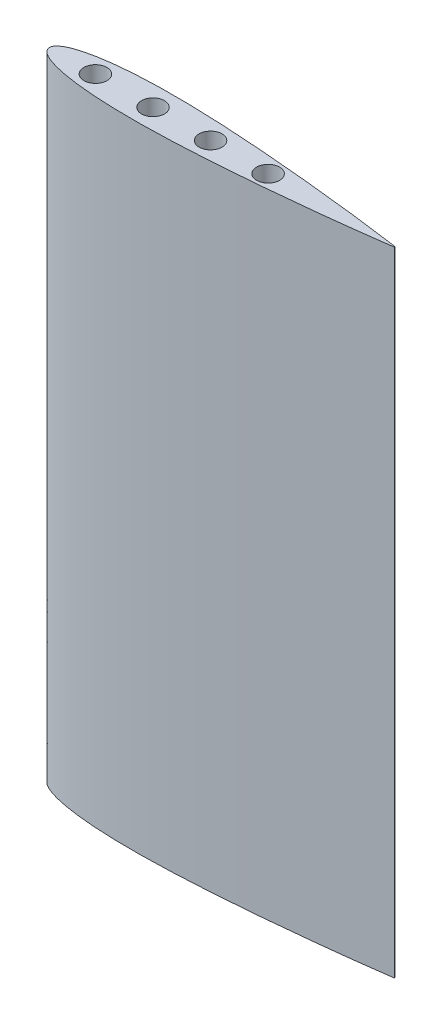
ISO-10303-21;
HEADER;
FILE_DESCRIPTION(('STEP AP214'),'2;1');
FILE_NAME('part.step','',(''),(''),'','','');
FILE_SCHEMA(('AUTOMOTIVE_DESIGN { 1 0 10303 214 1 1 1 1 }'));
ENDSEC;
DATA;
#1=APPLICATION_CONTEXT('core data for automotive mechanical design processes');
#2=APPLICATION_PROTOCOL_DEFINITION('international standard','automotive_design',2000,#1);
#3=PRODUCT_CONTEXT('',#1,'mechanical');
#4=PRODUCT('Part','Part','',(#3));
#5=PRODUCT_RELATED_PRODUCT_CATEGORY('part','',(#4));
#6=PRODUCT_DEFINITION_FORMATION('','',#4);
#7=PRODUCT_DEFINITION_CONTEXT('part definition',#1,'design');
#8=PRODUCT_DEFINITION('design','',#6,#7);
#9=PRODUCT_DEFINITION_SHAPE('','',#8);
#10=(LENGTH_UNIT() NAMED_UNIT(*) SI_UNIT(.MILLI.,.METRE.));
#11=(NAMED_UNIT(*) PLANE_ANGLE_UNIT() SI_UNIT($,.RADIAN.));
#12=(NAMED_UNIT(*) SI_UNIT($,.STERADIAN.) SOLID_ANGLE_UNIT());
#13=UNCERTAINTY_MEASURE_WITH_UNIT(LENGTH_MEASURE(1.E-05),#10,'distance_accuracy_value','');
#14=(GEOMETRIC_REPRESENTATION_CONTEXT(3) GLOBAL_UNCERTAINTY_ASSIGNED_CONTEXT((#13)) GLOBAL_UNIT_ASSIGNED_CONTEXT((#10,
#11,#12)) REPRESENTATION_CONTEXT('',''));
#15=CARTESIAN_POINT('',(0.,0.,0.));
#16=DIRECTION('',(0.,0.,1.));
#17=DIRECTION('',(1.,0.,0.));
#18=AXIS2_PLACEMENT_3D('',#15,#16,#17);
#19=CARTESIAN_POINT('',(38.1,69.85,-0.048006));
#20=CARTESIAN_POINT('',(38.0925832511895,69.85,-0.0490477650055649));
#21=CARTESIAN_POINT('',(38.0629429116157,69.85,-0.0532110809422408));
#22=CARTESIAN_POINT('',(37.9446472534428,69.85,-0.0697558566793161));
#23=CARTESIAN_POINT('',(37.7675621250952,69.85,-0.0944867430914153));
#24=CARTESIAN_POINT('',(37.5320525207163,69.85,-0.126965391859385));
#25=CARTESIAN_POINT('',(37.2903965573064,69.85,-0.160190200639637));
#26=CARTESIAN_POINT('',(37.0061271158188,69.85,-0.198904989146751));
#27=CARTESIAN_POINT('',(36.6799179371375,69.85,-0.242859005883359));
#28=CARTESIAN_POINT('',(36.3125415452336,69.85,-0.29186429375722));
#29=CARTESIAN_POINT('',(35.9048518161631,69.85,-0.345569022588783));
#30=CARTESIAN_POINT('',(35.4577986795233,69.85,-0.403720925509778));
#31=CARTESIAN_POINT('',(34.9724169838542,69.85,-0.465853222349389));
#32=CARTESIAN_POINT('',(34.2520601017265,69.85,-0.556772440334429));
#33=CARTESIAN_POINT('',(33.4845415955904,69.85,-0.651127112361376));
#34=CARTESIAN_POINT('',(32.6716373179434,69.85,-0.748448048268651));
#35=CARTESIAN_POINT('',(32.013353772097,69.85,-0.82573780924587));
#36=CARTESIAN_POINT('',(31.3247712932815,69.85,-0.904853152716957));
#37=CARTESIAN_POINT('',(30.607537281923,69.85,-0.985592030763642));
#38=CARTESIAN_POINT('',(29.8633043523687,69.85,-1.06737526082942));
#39=CARTESIAN_POINT('',(29.0938342883855,69.85,-1.14998319028334));
#40=CARTESIAN_POINT('',(28.3008940794852,69.85,-1.23282548784159));
#41=CARTESIAN_POINT('',(27.4863528469373,69.85,-1.31574863637591));
#42=CARTESIAN_POINT('',(26.6521029750128,69.85,-1.39811320683171));
#43=CARTESIAN_POINT('',(25.8001060198461,69.85,-1.47966051292485));
#44=CARTESIAN_POINT('',(24.9323404732456,69.85,-1.55982417312083));
#45=CARTESIAN_POINT('',(24.0508306191749,69.85,-1.63834210110569));
#46=CARTESIAN_POINT('',(23.1576406562735,69.85,-1.71456520147202));
#47=CARTESIAN_POINT('',(22.2548520722237,69.85,-1.78815253623454));
#48=CARTESIAN_POINT('',(21.344584785588,69.85,-1.85863416491333));
#49=CARTESIAN_POINT('',(20.428953151127,69.85,-1.92544429568828));
#50=CARTESIAN_POINT('',(19.5101089419927,69.85,-1.98816390230937));
#51=CARTESIAN_POINT('',(18.5901970685773,69.85,-2.04629199099451));
#52=CARTESIAN_POINT('',(17.6713468380571,69.85,-2.09926717966133));
#53=CARTESIAN_POINT('',(16.4547325832718,69.85,-2.16225319255771));
#54=CARTESIAN_POINT('',(14.9525757685026,69.85,-2.22569702265708));
#55=CARTESIAN_POINT('',(13.4659715477156,69.85,-2.26664545387174));
#56=CARTESIAN_POINT('',(12.3000911317475,69.85,-2.28358455102066));
#57=CARTESIAN_POINT('',(11.4480350286495,69.85,-2.28804827308279));
#58=CARTESIAN_POINT('',(10.6137266551807,69.85,-2.28410223520021));
#59=CARTESIAN_POINT('',(9.79911860646168,69.85,-2.27156902201927));
#60=CARTESIAN_POINT('',(9.00611977020172,69.85,-2.25006986753476));
#61=CARTESIAN_POINT('',(8.2365645526512,69.85,-2.21969990978284));
#62=CARTESIAN_POINT('',(7.49224861011493,69.85,-2.18024093358907));
#63=CARTESIAN_POINT('',(6.77490480464143,69.85,-2.13180353660556));
#64=CARTESIAN_POINT('',(6.08622231888325,69.85,-2.07439781875663));
#65=CARTESIAN_POINT('',(5.42780229802141,69.85,-2.00812811550919));
#66=CARTESIAN_POINT('',(4.80117460273118,69.85,-1.93324581886227));
#67=CARTESIAN_POINT('',(4.20778385491808,69.85,-1.85005530448883));
#68=CARTESIAN_POINT('',(3.64902794191651,69.85,-1.75871164667066));
#69=CARTESIAN_POINT('',(3.1261874267588,69.85,-1.65967136646688));
#70=CARTESIAN_POINT('',(2.64046561827519,69.85,-1.55330686977665));
#71=CARTESIAN_POINT('',(2.19299768796404,69.85,-1.43997872175089));
#72=CARTESIAN_POINT('',(1.78477240041268,69.85,-1.32019461373086));
#73=CARTESIAN_POINT('',(1.416689891716,69.85,-1.1943523482514));
#74=CARTESIAN_POINT('',(1.0895351178981,69.85,-1.06288655664468));
#75=CARTESIAN_POINT('',(0.803955696852375,69.85,-0.926176493001448));
#76=CARTESIAN_POINT('',(0.560495694538755,69.85,-0.784506781043438));
#77=CARTESIAN_POINT('',(0.359438610040117,69.85,-0.638117578672457));
#78=CARTESIAN_POINT('',(0.201172940149243,69.85,-0.486768083972346));
#79=CARTESIAN_POINT('',(0.0860803469315414,69.85,-0.330029548931076));
#80=CARTESIAN_POINT('',(0.0157125538685244,69.85,-0.167135854074328));
#81=CARTESIAN_POINT('',(-0.00765895667675501,69.85,0.));
#82=CARTESIAN_POINT('',(0.0157125538685251,69.85,0.167135854074332));
#83=CARTESIAN_POINT('',(0.08608034693154,69.85,0.330029548931073));
#84=CARTESIAN_POINT('',(0.201172940149245,69.85,0.486768083972348));
#85=CARTESIAN_POINT('',(0.359438610040117,69.85,0.638117578672457));
#86=CARTESIAN_POINT('',(0.560495694538755,69.85,0.784506781043438));
#87=CARTESIAN_POINT('',(0.803955696852377,69.85,0.926176493001449));
#88=CARTESIAN_POINT('',(1.0895351178981,69.85,1.06288655664468));
#89=CARTESIAN_POINT('',(1.416689891716,69.85,1.1943523482514));
#90=CARTESIAN_POINT('',(1.78477240041268,69.85,1.32019461373086));
#91=CARTESIAN_POINT('',(2.19299768796404,69.85,1.43997872175089));
#92=CARTESIAN_POINT('',(2.64046561827519,69.85,1.55330686977665));
#93=CARTESIAN_POINT('',(3.1261874267588,69.85,1.65967136646688));
#94=CARTESIAN_POINT('',(3.64902794191651,69.85,1.75871164667066));
#95=CARTESIAN_POINT('',(4.20778385491808,69.85,1.85005530448883));
#96=CARTESIAN_POINT('',(4.80117460273118,69.85,1.93324581886227));
#97=CARTESIAN_POINT('',(5.42780229802141,69.85,2.00812811550919));
#98=CARTESIAN_POINT('',(6.08622231888325,69.85,2.07439781875663));
#99=CARTESIAN_POINT('',(6.77490480464143,69.85,2.13180353660556));
#100=CARTESIAN_POINT('',(7.49224861011493,69.85,2.18024093358907));
#101=CARTESIAN_POINT('',(8.23656455265121,69.85,2.21969990978284));
#102=CARTESIAN_POINT('',(9.00611977020172,69.85,2.25006986753476));
#103=CARTESIAN_POINT('',(9.79911860646167,69.85,2.27156902201927));
#104=CARTESIAN_POINT('',(10.6137266551807,69.85,2.2841022352002));
#105=CARTESIAN_POINT('',(11.4480350286495,69.85,2.28804827308279));
#106=CARTESIAN_POINT('',(12.3000911317475,69.85,2.28358455102066));
#107=CARTESIAN_POINT('',(13.4659715477156,69.85,2.26664545387174));
#108=CARTESIAN_POINT('',(14.6487121561619,69.85,2.23406692908852));
#109=CARTESIAN_POINT('',(16.1510694338133,69.85,2.17621559673462));
#110=CARTESIAN_POINT('',(17.3678808007291,69.85,2.11676314369055));
#111=CARTESIAN_POINT('',(18.5901970685773,69.85,2.04629199099451));
#112=CARTESIAN_POINT('',(19.5101089419927,69.85,1.98816390230937));
#113=CARTESIAN_POINT('',(20.428953151127,69.85,1.92544429568828));
#114=CARTESIAN_POINT('',(21.344584785588,69.85,1.85863416491333));
#115=CARTESIAN_POINT('',(22.2548520722237,69.85,1.78815253623454));
#116=CARTESIAN_POINT('',(23.1576406562735,69.85,1.71456520147202));
#117=CARTESIAN_POINT('',(24.0508306191749,69.85,1.63834210110569));
#118=CARTESIAN_POINT('',(24.9323404732456,69.85,1.55982417312083));
#119=CARTESIAN_POINT('',(25.8001060198462,69.85,1.47966051292485));
#120=CARTESIAN_POINT('',(26.6521029750128,69.85,1.39811320683171));
#121=CARTESIAN_POINT('',(27.4863528469373,69.85,1.31574863637591));
#122=CARTESIAN_POINT('',(28.3008940794852,69.85,1.23282548784159));
#123=CARTESIAN_POINT('',(29.0938342883855,69.85,1.14998319028334));
#124=CARTESIAN_POINT('',(29.8633043523686,69.85,1.06737526082942));
#125=CARTESIAN_POINT('',(30.607537281923,69.85,0.985592030763641));
#126=CARTESIAN_POINT('',(31.3247712932815,69.85,0.904853152716957));
#127=CARTESIAN_POINT('',(32.013353772097,69.85,0.825737809245871));
#128=CARTESIAN_POINT('',(32.6716373179434,69.85,0.74844804826865));
#129=CARTESIAN_POINT('',(33.4845415955904,69.85,0.651127112361377));
#130=CARTESIAN_POINT('',(34.2520601017265,69.85,0.556772440334429));
#131=CARTESIAN_POINT('',(34.9724169838542,69.85,0.465853222349389));
#132=CARTESIAN_POINT('',(35.4577986795233,69.85,0.403720925509777));
#133=CARTESIAN_POINT('',(35.9048518161631,69.85,0.345569022588783));
#134=CARTESIAN_POINT('',(36.3125415452337,69.85,0.29186429375722));
#135=CARTESIAN_POINT('',(36.6799179371375,69.85,0.242859005883359));
#136=CARTESIAN_POINT('',(37.0061271158188,69.85,0.198904989146751));
#137=CARTESIAN_POINT('',(37.2903965573064,69.85,0.160190200639636));
#138=CARTESIAN_POINT('',(37.5320525207163,69.85,0.126965391859385));
#139=CARTESIAN_POINT('',(37.7675621250952,69.85,0.0944867430914158));
#140=CARTESIAN_POINT('',(37.9446472534428,69.85,0.0697558566793164));
#141=CARTESIAN_POINT('',(38.0629429116156,69.85,0.0532110809422402));
#142=CARTESIAN_POINT('',(38.0925832511895,69.85,0.0490477650055649));
#143=CARTESIAN_POINT('',(38.1,69.85,0.048006));
#144=B_SPLINE_CURVE_WITH_KNOTS('',3,(#19,#20,#21,#22,#23,#24,#25,#26,#27,#28,#29,#30,#31,#32,
#33,#34,#35,#36,#37,#38,#39,#40,#41,#42,#43,#44,#45,#46,#47,#48,#49,#50,#51,#52,#53,#54,#55,#56,
#57,#58,#59,#60,#61,#62,#63,#64,#65,#66,#67,#68,#69,#70,#71,#72,#73,#74,#75,#76,#77,#78,#79,#80,
#81,#82,#83,#84,#85,#86,#87,#88,#89,#90,#91,#92,#93,#94,#95,#96,#97,#98,#99,#100,#101,#102,#103,
#104,#105,#106,#107,#108,#109,#110,#111,#112,#113,#114,#115,#116,#117,#118,#119,#120,#121,#122,
#123,#124,#125,#126,#127,#128,#129,#130,#131,#132,#133,#134,#135,#136,#137,#138,#139,#140,#141,
#142,#143),.UNSPECIFIED.,.F.,.F.,(4,1,1,1,1,1,1,1,1,1,1,1,1,1,1,1,1,1,1,1,1,1,1,1,1,1,1,1,1,1,1,
1,1,1,1,1,1,1,1,1,1,1,1,1,1,1,1,1,1,1,1,1,1,1,1,1,1,1,1,1,1,1,1,1,1,1,1,1,1,1,1,1,1,1,1,1,1,1,1,
1,1,1,1,1,1,1,1,1,1,1,1,1,1,1,1,1,1,1,1,1,1,1,1,1,1,1,1,1,1,1,1,1,1,1,1,1,1,1,1,1,1,1,4),(0.,
0.000289201378228521,0.00115576612811497,0.00461232240327458,0.00719351750498132,
0.0103357928948399,0.0140313969623455,0.018271612085312,0.0230458473649678,0.028342900869087,
0.0341501195438392,0.0404537601194176,0.0472383298988337,0.0621866127014249,0.0703137241968128,
0.0788519079930909,0.0877801263970521,0.0970775209084767,0.106722048517726,0.116690867689892,
0.126960504753417,0.137507218023907,0.148306054540842,0.159330764906486,0.170556489755232,
0.181956531155254,0.193504043461122,0.205171366742428,0.216932300344852,0.228758168756787,
0.24062140048393,0.252494935762872,0.264350287074715,0.276160573352716,0.299535853600575,
0.322404758964057,0.333584031906799,0.344559265520828,0.35530595971865,0.365799778375851,
0.376017570419826,0.385937299648592,0.395537658905913,0.404797976198219,0.413698812078543,
0.422221441287427,0.430349273099822,0.438066019294824,0.445356904422305,0.452209372098903,
0.458611567079498,0.46455404405062,0.470029850192536,0.475034902370301,0.479569141493346,
0.483636857140142,0.487250262770082,0.490431337960153,0.493218828079602,0.495674085869199,
0.497891368316545,0.5,0.502108631683455,0.504325914130801,0.506781171920398,0.509568662039847,
0.512749737229917,0.516363142859858,0.520430858506653,0.524965097629699,0.529970149807463,
0.535445955949379,0.541388432920502,0.547790627901097,0.554643095577695,0.561933980705176,
0.569650726900177,0.577778558712573,0.586301187921457,0.595202023801781,0.604462341094087,
0.614062700351407,0.623982429580174,0.634200221624149,0.64469404028135,0.655440734479172,
0.666415968093201,0.677595241035942,0.700464146399425,0.712102005681195,0.735649712925285,
0.747505064237128,0.759378599516069,0.771241831243212,0.783067699655148,0.794828633257571,
0.806495956538878,0.818043468844746,0.829443510244767,0.840669235093514,0.851693945459158,
0.862492781976093,0.873039495246583,0.883309132310108,0.893277951482274,0.902922479091523,
0.912219873602948,0.921148092006909,0.929686275803187,0.937813387298575,0.952761670101166,
0.959546239880582,0.965849880456161,0.971657099130913,0.976954152635032,0.981728387914688,
0.985968603037654,0.98966420710516,0.992806482495019,0.995387677596725,0.998844233871885,
0.999710798621771,1.),.UNSPECIFIED.);
#145=DIRECTION('',(0.,-1.,0.));
#146=VECTOR('',#145,1.);
#147=SURFACE_OF_LINEAR_EXTRUSION('',#144,#146);
#148=CARTESIAN_POINT('',(38.1,0.,-0.048006));
#149=CARTESIAN_POINT('',(38.0925832511895,0.,-0.0490477650055649));
#150=CARTESIAN_POINT('',(38.0629429116157,0.,-0.0532110809422408));
#151=CARTESIAN_POINT('',(37.9446472534428,0.,-0.0697558566793161));
#152=CARTESIAN_POINT('',(37.7675621250952,0.,-0.0944867430914153));
#153=CARTESIAN_POINT('',(37.5320525207163,0.,-0.126965391859385));
#154=CARTESIAN_POINT('',(37.2903965573064,0.,-0.160190200639637));
#155=CARTESIAN_POINT('',(37.0061271158188,0.,-0.198904989146751));
#156=CARTESIAN_POINT('',(36.6799179371375,0.,-0.242859005883359));
#157=CARTESIAN_POINT('',(36.3125415452336,0.,-0.29186429375722));
#158=CARTESIAN_POINT('',(35.9048518161631,0.,-0.345569022588783));
#159=CARTESIAN_POINT('',(35.4577986795233,0.,-0.403720925509778));
#160=CARTESIAN_POINT('',(34.9724169838542,0.,-0.465853222349389));
#161=CARTESIAN_POINT('',(34.2520601017265,0.,-0.556772440334429));
#162=CARTESIAN_POINT('',(33.4845415955904,0.,-0.651127112361376));
#163=CARTESIAN_POINT('',(32.6716373179434,0.,-0.748448048268651));
#164=CARTESIAN_POINT('',(32.013353772097,0.,-0.82573780924587));
#165=CARTESIAN_POINT('',(31.3247712932815,0.,-0.904853152716957));
#166=CARTESIAN_POINT('',(30.607537281923,0.,-0.985592030763642));
#167=CARTESIAN_POINT('',(29.8633043523687,0.,-1.06737526082942));
#168=CARTESIAN_POINT('',(29.0938342883855,0.,-1.14998319028334));
#169=CARTESIAN_POINT('',(28.3008940794852,0.,-1.23282548784159));
#170=CARTESIAN_POINT('',(27.4863528469373,0.,-1.31574863637591));
#171=CARTESIAN_POINT('',(26.6521029750128,0.,-1.39811320683171));
#172=CARTESIAN_POINT('',(25.8001060198461,0.,-1.47966051292485));
#173=CARTESIAN_POINT('',(24.9323404732456,0.,-1.55982417312083));
#174=CARTESIAN_POINT('',(24.0508306191749,0.,-1.63834210110569));
#175=CARTESIAN_POINT('',(23.1576406562735,0.,-1.71456520147202));
#176=CARTESIAN_POINT('',(22.2548520722237,0.,-1.78815253623454));
#177=CARTESIAN_POINT('',(21.344584785588,0.,-1.85863416491333));
#178=CARTESIAN_POINT('',(20.428953151127,0.,-1.92544429568828));
#179=CARTESIAN_POINT('',(19.5101089419927,0.,-1.98816390230937));
#180=CARTESIAN_POINT('',(18.5901970685773,0.,-2.04629199099451));
#181=CARTESIAN_POINT('',(17.6713468380571,0.,-2.09926717966133));
#182=CARTESIAN_POINT('',(16.4547325832718,0.,-2.16225319255771));
#183=CARTESIAN_POINT('',(14.9525757685026,0.,-2.22569702265708));
#184=CARTESIAN_POINT('',(13.4659715477156,0.,-2.26664545387174));
#185=CARTESIAN_POINT('',(12.3000911317475,0.,-2.28358455102066));
#186=CARTESIAN_POINT('',(11.4480350286495,0.,-2.28804827308279));
#187=CARTESIAN_POINT('',(10.6137266551807,0.,-2.28410223520021));
#188=CARTESIAN_POINT('',(9.79911860646168,0.,-2.27156902201927));
#189=CARTESIAN_POINT('',(9.00611977020172,0.,-2.25006986753476));
#190=CARTESIAN_POINT('',(8.2365645526512,0.,-2.21969990978284));
#191=CARTESIAN_POINT('',(7.49224861011493,0.,-2.18024093358907));
#192=CARTESIAN_POINT('',(6.77490480464143,0.,-2.13180353660556));
#193=CARTESIAN_POINT('',(6.08622231888325,0.,-2.07439781875663));
#194=CARTESIAN_POINT('',(5.42780229802141,0.,-2.00812811550919));
#195=CARTESIAN_POINT('',(4.80117460273118,0.,-1.93324581886227));
#196=CARTESIAN_POINT('',(4.20778385491808,0.,-1.85005530448883));
#197=CARTESIAN_POINT('',(3.64902794191651,0.,-1.75871164667066));
#198=CARTESIAN_POINT('',(3.1261874267588,0.,-1.65967136646688));
#199=CARTESIAN_POINT('',(2.64046561827519,0.,-1.55330686977665));
#200=CARTESIAN_POINT('',(2.19299768796404,0.,-1.43997872175089));
#201=CARTESIAN_POINT('',(1.78477240041268,0.,-1.32019461373086));
#202=CARTESIAN_POINT('',(1.416689891716,0.,-1.1943523482514));
#203=CARTESIAN_POINT('',(1.0895351178981,0.,-1.06288655664468));
#204=CARTESIAN_POINT('',(0.803955696852375,0.,-0.926176493001448));
#205=CARTESIAN_POINT('',(0.560495694538755,0.,-0.784506781043438));
#206=CARTESIAN_POINT('',(0.359438610040117,0.,-0.638117578672457));
#207=CARTESIAN_POINT('',(0.201172940149243,0.,-0.486768083972346));
#208=CARTESIAN_POINT('',(0.0860803469315414,0.,-0.330029548931076));
#209=CARTESIAN_POINT('',(0.0157125538685244,0.,-0.167135854074328));
#210=CARTESIAN_POINT('',(-0.00765895667675501,0.,0.));
#211=CARTESIAN_POINT('',(0.0157125538685251,0.,0.167135854074332));
#212=CARTESIAN_POINT('',(0.08608034693154,0.,0.330029548931073));
#213=CARTESIAN_POINT('',(0.201172940149245,0.,0.486768083972348));
#214=CARTESIAN_POINT('',(0.359438610040117,0.,0.638117578672457));
#215=CARTESIAN_POINT('',(0.560495694538755,0.,0.784506781043438));
#216=CARTESIAN_POINT('',(0.803955696852377,0.,0.926176493001449));
#217=CARTESIAN_POINT('',(1.0895351178981,0.,1.06288655664468));
#218=CARTESIAN_POINT('',(1.416689891716,0.,1.1943523482514));
#219=CARTESIAN_POINT('',(1.78477240041268,0.,1.32019461373086));
#220=CARTESIAN_POINT('',(2.19299768796404,0.,1.43997872175089));
#221=CARTESIAN_POINT('',(2.64046561827519,0.,1.55330686977665));
#222=CARTESIAN_POINT('',(3.1261874267588,0.,1.65967136646688));
#223=CARTESIAN_POINT('',(3.64902794191651,0.,1.75871164667066));
#224=CARTESIAN_POINT('',(4.20778385491808,0.,1.85005530448883));
#225=CARTESIAN_POINT('',(4.80117460273118,0.,1.93324581886227));
#226=CARTESIAN_POINT('',(5.42780229802141,0.,2.00812811550919));
#227=CARTESIAN_POINT('',(6.08622231888325,0.,2.07439781875663));
#228=CARTESIAN_POINT('',(6.77490480464143,0.,2.13180353660556));
#229=CARTESIAN_POINT('',(7.49224861011493,0.,2.18024093358907));
#230=CARTESIAN_POINT('',(8.23656455265121,0.,2.21969990978284));
#231=CARTESIAN_POINT('',(9.00611977020172,0.,2.25006986753476));
#232=CARTESIAN_POINT('',(9.79911860646167,0.,2.27156902201927));
#233=CARTESIAN_POINT('',(10.6137266551807,0.,2.2841022352002));
#234=CARTESIAN_POINT('',(11.4480350286495,0.,2.28804827308279));
#235=CARTESIAN_POINT('',(12.3000911317475,0.,2.28358455102066));
#236=CARTESIAN_POINT('',(13.4659715477156,0.,2.26664545387174));
#237=CARTESIAN_POINT('',(14.6487121561619,0.,2.23406692908852));
#238=CARTESIAN_POINT('',(16.1510694338133,0.,2.17621559673462));
#239=CARTESIAN_POINT('',(17.3678808007291,0.,2.11676314369055));
#240=CARTESIAN_POINT('',(18.5901970685773,0.,2.04629199099451));
#241=CARTESIAN_POINT('',(19.5101089419927,0.,1.98816390230937));
#242=CARTESIAN_POINT('',(20.428953151127,0.,1.92544429568828));
#243=CARTESIAN_POINT('',(21.344584785588,0.,1.85863416491333));
#244=CARTESIAN_POINT('',(22.2548520722237,0.,1.78815253623454));
#245=CARTESIAN_POINT('',(23.1576406562735,0.,1.71456520147202));
#246=CARTESIAN_POINT('',(24.0508306191749,0.,1.63834210110569));
#247=CARTESIAN_POINT('',(24.9323404732456,0.,1.55982417312083));
#248=CARTESIAN_POINT('',(25.8001060198462,0.,1.47966051292485));
#249=CARTESIAN_POINT('',(26.6521029750128,0.,1.39811320683171));
#250=CARTESIAN_POINT('',(27.4863528469373,0.,1.31574863637591));
#251=CARTESIAN_POINT('',(28.3008940794852,0.,1.23282548784159));
#252=CARTESIAN_POINT('',(29.0938342883855,0.,1.14998319028334));
#253=CARTESIAN_POINT('',(29.8633043523686,0.,1.06737526082942));
#254=CARTESIAN_POINT('',(30.607537281923,0.,0.985592030763641));
#255=CARTESIAN_POINT('',(31.3247712932815,0.,0.904853152716957));
#256=CARTESIAN_POINT('',(32.013353772097,0.,0.825737809245871));
#257=CARTESIAN_POINT('',(32.6716373179434,0.,0.74844804826865));
#258=CARTESIAN_POINT('',(33.4845415955904,0.,0.651127112361377));
#259=CARTESIAN_POINT('',(34.2520601017265,0.,0.556772440334429));
#260=CARTESIAN_POINT('',(34.9724169838542,0.,0.465853222349389));
#261=CARTESIAN_POINT('',(35.4577986795233,0.,0.403720925509777));
#262=CARTESIAN_POINT('',(35.9048518161631,0.,0.345569022588783));
#263=CARTESIAN_POINT('',(36.3125415452337,0.,0.29186429375722));
#264=CARTESIAN_POINT('',(36.6799179371375,0.,0.242859005883359));
#265=CARTESIAN_POINT('',(37.0061271158188,0.,0.198904989146751));
#266=CARTESIAN_POINT('',(37.2903965573064,0.,0.160190200639636));
#267=CARTESIAN_POINT('',(37.5320525207163,0.,0.126965391859385));
#268=CARTESIAN_POINT('',(37.7675621250952,0.,0.0944867430914158));
#269=CARTESIAN_POINT('',(37.9446472534428,0.,0.0697558566793164));
#270=CARTESIAN_POINT('',(38.0629429116156,0.,0.0532110809422402));
#271=CARTESIAN_POINT('',(38.0925832511895,0.,0.0490477650055649));
#272=CARTESIAN_POINT('',(38.1,0.,0.048006));
#273=B_SPLINE_CURVE_WITH_KNOTS('',3,(#148,#149,#150,#151,#152,#153,#154,#155,#156,#157,#158,
#159,#160,#161,#162,#163,#164,#165,#166,#167,#168,#169,#170,#171,#172,#173,#174,#175,#176,#177,
#178,#179,#180,#181,#182,#183,#184,#185,#186,#187,#188,#189,#190,#191,#192,#193,#194,#195,#196,
#197,#198,#199,#200,#201,#202,#203,#204,#205,#206,#207,#208,#209,#210,#211,#212,#213,#214,#215,
#216,#217,#218,#219,#220,#221,#222,#223,#224,#225,#226,#227,#228,#229,#230,#231,#232,#233,#234,
#235,#236,#237,#238,#239,#240,#241,#242,#243,#244,#245,#246,#247,#248,#249,#250,#251,#252,#253,
#254,#255,#256,#257,#258,#259,#260,#261,#262,#263,#264,#265,#266,#267,#268,#269,#270,#271,#272),
.UNSPECIFIED.,.F.,.F.,(4,1,1,1,1,1,1,1,1,1,1,1,1,1,1,1,1,1,1,1,1,1,1,1,1,1,1,1,1,1,1,1,1,1,1,1,
1,1,1,1,1,1,1,1,1,1,1,1,1,1,1,1,1,1,1,1,1,1,1,1,1,1,1,1,1,1,1,1,1,1,1,1,1,1,1,1,1,1,1,1,1,1,1,1,
1,1,1,1,1,1,1,1,1,1,1,1,1,1,1,1,1,1,1,1,1,1,1,1,1,1,1,1,1,1,1,1,1,1,1,1,1,1,4),(0.,
0.000289201378228521,0.00115576612811497,0.00461232240327458,0.00719351750498132,
0.0103357928948399,0.0140313969623455,0.018271612085312,0.0230458473649678,0.028342900869087,
0.0341501195438392,0.0404537601194176,0.0472383298988337,0.0621866127014249,0.0703137241968128,
0.0788519079930909,0.0877801263970521,0.0970775209084767,0.106722048517726,0.116690867689892,
0.126960504753417,0.137507218023907,0.148306054540842,0.159330764906486,0.170556489755232,
0.181956531155254,0.193504043461122,0.205171366742428,0.216932300344852,0.228758168756787,
0.24062140048393,0.252494935762872,0.264350287074715,0.276160573352716,0.299535853600575,
0.322404758964057,0.333584031906799,0.344559265520828,0.35530595971865,0.365799778375851,
0.376017570419826,0.385937299648592,0.395537658905913,0.404797976198219,0.413698812078543,
0.422221441287427,0.430349273099822,0.438066019294824,0.445356904422305,0.452209372098903,
0.458611567079498,0.46455404405062,0.470029850192536,0.475034902370301,0.479569141493346,
0.483636857140142,0.487250262770082,0.490431337960153,0.493218828079602,0.495674085869199,
0.497891368316545,0.5,0.502108631683455,0.504325914130801,0.506781171920398,0.509568662039847,
0.512749737229917,0.516363142859858,0.520430858506653,0.524965097629699,0.529970149807463,
0.535445955949379,0.541388432920502,0.547790627901097,0.554643095577695,0.561933980705176,
0.569650726900177,0.577778558712573,0.586301187921457,0.595202023801781,0.604462341094087,
0.614062700351407,0.623982429580174,0.634200221624149,0.64469404028135,0.655440734479172,
0.666415968093201,0.677595241035942,0.700464146399425,0.712102005681195,0.735649712925285,
0.747505064237128,0.759378599516069,0.771241831243212,0.783067699655148,0.794828633257571,
0.806495956538878,0.818043468844746,0.829443510244767,0.840669235093514,0.851693945459158,
0.862492781976093,0.873039495246583,0.883309132310108,0.893277951482274,0.902922479091523,
0.912219873602948,0.921148092006909,0.929686275803187,0.937813387298575,0.952761670101166,
0.959546239880582,0.965849880456161,0.971657099130913,0.976954152635032,0.981728387914688,
0.985968603037654,0.98966420710516,0.992806482495019,0.995387677596725,0.998844233871885,
0.999710798621771,1.),.UNSPECIFIED.);
#274=CARTESIAN_POINT('',(38.1,0.,-0.048006));
#275=VERTEX_POINT('',#274);
#276=CARTESIAN_POINT('',(38.1,0.,0.048006));
#277=VERTEX_POINT('',#276);
#278=EDGE_CURVE('E69',#275,#277,#273,.T.);
#279=ORIENTED_EDGE('',*,*,#278,.T.);
#280=DIRECTION('',(0.,-1.,0.));
#281=VECTOR('',#280,1.);
#282=CARTESIAN_POINT('',(38.1,69.85,0.048006));
#283=LINE('',#282,#281);
#284=CARTESIAN_POINT('',(38.1,69.85,0.048006));
#285=VERTEX_POINT('',#284);
#286=EDGE_CURVE('E11',#285,#277,#283,.T.);
#287=ORIENTED_EDGE('',*,*,#286,.F.);
#288=CARTESIAN_POINT('',(38.1,69.85,-0.048006));
#289=VERTEX_POINT('',#288);
#290=EDGE_CURVE('E68',#289,#285,#144,.T.);
#291=ORIENTED_EDGE('',*,*,#290,.F.);
#292=DIRECTION('',(0.,-1.,0.));
#293=VECTOR('',#292,1.);
#294=CARTESIAN_POINT('',(38.1,69.85,-0.048006));
#295=LINE('',#294,#293);
#296=EDGE_CURVE('E46',#289,#275,#295,.T.);
#297=ORIENTED_EDGE('',*,*,#296,.T.);
#298=EDGE_LOOP('',(#279,#287,#291,#297));
#299=FACE_BOUND('',#298,.T.);
#300=ADVANCED_FACE('F37',(#299),#147,.F.);
#301=CARTESIAN_POINT('',(38.1,69.85,-0.048006));
#302=DIRECTION('',(-1.,0.,0.));
#303=DIRECTION('',(0.,0.,1.));
#304=AXIS2_PLACEMENT_3D('',#301,#302,#303);
#305=PLANE('',#304);
#306=DIRECTION('',(0.,0.,-1.));
#307=VECTOR('',#306,1.);
#308=CARTESIAN_POINT('',(38.1,0.,-0.048006));
#309=LINE('',#308,#307);
#310=EDGE_CURVE('E61',#277,#275,#309,.T.);
#311=ORIENTED_EDGE('',*,*,#310,.T.);
#312=ORIENTED_EDGE('',*,*,#296,.F.);
#313=DIRECTION('',(0.,0.,-1.));
#314=VECTOR('',#313,1.);
#315=CARTESIAN_POINT('',(38.1,69.85,-0.048006));
#316=LINE('',#315,#314);
#317=EDGE_CURVE('E53',#285,#289,#316,.T.);
#318=ORIENTED_EDGE('',*,*,#317,.F.);
#319=ORIENTED_EDGE('',*,*,#286,.T.);
#320=EDGE_LOOP('',(#311,#312,#318,#319));
#321=FACE_BOUND('',#320,.T.);
#322=ADVANCED_FACE('F64',(#321),#305,.F.);
#323=CARTESIAN_POINT('',(0.,69.85,0.));
#324=DIRECTION('',(0.,1.,0.));
#325=DIRECTION('',(0.,0.,1.));
#326=AXIS2_PLACEMENT_3D('',#323,#324,#325);
#327=PLANE('',#326);
#328=CARTESIAN_POINT('',(5.08,69.85,0.));
#329=DIRECTION('',(0.,1.,0.));
#330=DIRECTION('',(0.,0.,1.));
#331=AXIS2_PLACEMENT_3D('',#328,#329,#330);
#332=CIRCLE('',#331,1.27);
#333=CARTESIAN_POINT('',(5.08,69.85,1.27));
#334=VERTEX_POINT('',#333);
#335=EDGE_CURVE('E76',#334,#334,#332,.T.);
#336=ORIENTED_EDGE('',*,*,#335,.F.);
#337=EDGE_LOOP('',(#336));
#338=FACE_BOUND('',#337,.T.);
#339=CARTESIAN_POINT('',(11.43,69.85,0.));
#340=DIRECTION('',(0.,1.,0.));
#341=DIRECTION('',(0.,0.,1.));
#342=AXIS2_PLACEMENT_3D('',#339,#340,#341);
#343=CIRCLE('',#342,1.27);
#344=CARTESIAN_POINT('',(11.43,69.85,1.27));
#345=VERTEX_POINT('',#344);
#346=EDGE_CURVE('E106',#345,#345,#343,.T.);
#347=ORIENTED_EDGE('',*,*,#346,.F.);
#348=EDGE_LOOP('',(#347));
#349=FACE_BOUND('',#348,.T.);
#350=CARTESIAN_POINT('',(17.78,69.85,0.));
#351=DIRECTION('',(0.,1.,0.));
#352=DIRECTION('',(0.,0.,1.));
#353=AXIS2_PLACEMENT_3D('',#350,#351,#352);
#354=CIRCLE('',#353,1.27);
#355=CARTESIAN_POINT('',(17.78,69.85,1.27));
#356=VERTEX_POINT('',#355);
#357=EDGE_CURVE('E100',#356,#356,#354,.T.);
#358=ORIENTED_EDGE('',*,*,#357,.F.);
#359=EDGE_LOOP('',(#358));
#360=FACE_BOUND('',#359,.T.);
#361=CARTESIAN_POINT('',(24.13,69.85,0.));
#362=DIRECTION('',(0.,1.,0.));
#363=DIRECTION('',(0.,0.,1.));
#364=AXIS2_PLACEMENT_3D('',#361,#362,#363);
#365=CIRCLE('',#364,1.27);
#366=CARTESIAN_POINT('',(24.13,69.85,1.27));
#367=VERTEX_POINT('',#366);
#368=EDGE_CURVE('E94',#367,#367,#365,.T.);
#369=ORIENTED_EDGE('',*,*,#368,.F.);
#370=EDGE_LOOP('',(#369));
#371=FACE_BOUND('',#370,.T.);
#372=ORIENTED_EDGE('',*,*,#290,.T.);
#373=ORIENTED_EDGE('',*,*,#317,.T.);
#374=EDGE_LOOP('',(#372,#373));
#375=FACE_BOUND('',#374,.T.);
#376=ADVANCED_FACE('F114',(#338,#349,#360,#371,#375),#327,.T.);
#377=CARTESIAN_POINT('',(0.,0.,0.));
#378=DIRECTION('',(0.,1.,0.));
#379=DIRECTION('',(0.,0.,1.));
#380=AXIS2_PLACEMENT_3D('',#377,#378,#379);
#381=PLANE('',#380);
#382=ORIENTED_EDGE('',*,*,#278,.F.);
#383=ORIENTED_EDGE('',*,*,#310,.F.);
#384=EDGE_LOOP('',(#382,#383));
#385=FACE_BOUND('',#384,.T.);
#386=ADVANCED_FACE('F72',(#385),#381,.F.);
#387=CARTESIAN_POINT('',(24.13,57.15,0.));
#388=DIRECTION('',(0.,1.,0.));
#389=DIRECTION('',(0.,0.,1.));
#390=AXIS2_PLACEMENT_3D('',#387,#388,#389);
#391=CYLINDRICAL_SURFACE('',#390,1.27);
#392=CARTESIAN_POINT('',(24.13,57.15,0.));
#393=DIRECTION('',(0.,1.,0.));
#394=DIRECTION('',(0.,0.,1.));
#395=AXIS2_PLACEMENT_3D('',#392,#393,#394);
#396=CIRCLE('',#395,1.27);
#397=CARTESIAN_POINT('',(24.13,57.15,1.27));
#398=VERTEX_POINT('',#397);
#399=EDGE_CURVE('E88',#398,#398,#396,.T.);
#400=ORIENTED_EDGE('',*,*,#399,.F.);
#401=EDGE_LOOP('',(#400));
#402=FACE_BOUND('',#401,.T.);
#403=ORIENTED_EDGE('',*,*,#368,.T.);
#404=EDGE_LOOP('',(#403));
#405=FACE_BOUND('',#404,.T.);
#406=ADVANCED_FACE('F124',(#402,#405),#391,.F.);
#407=CARTESIAN_POINT('',(24.13,57.15,0.));
#408=DIRECTION('',(0.,1.,0.));
#409=DIRECTION('',(0.,0.,1.));
#410=AXIS2_PLACEMENT_3D('',#407,#408,#409);
#411=PLANE('',#410);
#412=ORIENTED_EDGE('',*,*,#399,.T.);
#413=EDGE_LOOP('',(#412));
#414=FACE_BOUND('',#413,.T.);
#415=ADVANCED_FACE('F126',(#414),#411,.T.);
#416=CARTESIAN_POINT('',(17.78,57.15,0.));
#417=DIRECTION('',(0.,1.,0.));
#418=DIRECTION('',(0.,0.,1.));
#419=AXIS2_PLACEMENT_3D('',#416,#417,#418);
#420=CYLINDRICAL_SURFACE('',#419,1.27);
#421=CARTESIAN_POINT('',(17.78,57.15,0.));
#422=DIRECTION('',(0.,1.,0.));
#423=DIRECTION('',(0.,0.,1.));
#424=AXIS2_PLACEMENT_3D('',#421,#422,#423);
#425=CIRCLE('',#424,1.27);
#426=CARTESIAN_POINT('',(17.78,57.15,1.27));
#427=VERTEX_POINT('',#426);
#428=EDGE_CURVE('E97',#427,#427,#425,.T.);
#429=ORIENTED_EDGE('',*,*,#428,.F.);
#430=EDGE_LOOP('',(#429));
#431=FACE_BOUND('',#430,.T.);
#432=ORIENTED_EDGE('',*,*,#357,.T.);
#433=EDGE_LOOP('',(#432));
#434=FACE_BOUND('',#433,.T.);
#435=ADVANCED_FACE('F133',(#431,#434),#420,.F.);
#436=CARTESIAN_POINT('',(17.78,57.15,0.));
#437=DIRECTION('',(0.,1.,0.));
#438=DIRECTION('',(0.,0.,1.));
#439=AXIS2_PLACEMENT_3D('',#436,#437,#438);
#440=PLANE('',#439);
#441=ORIENTED_EDGE('',*,*,#428,.T.);
#442=EDGE_LOOP('',(#441));
#443=FACE_BOUND('',#442,.T.);
#444=ADVANCED_FACE('F182',(#443),#440,.T.);
#445=CARTESIAN_POINT('',(11.43,57.15,0.));
#446=DIRECTION('',(0.,1.,0.));
#447=DIRECTION('',(0.,0.,1.));
#448=AXIS2_PLACEMENT_3D('',#445,#446,#447);
#449=CYLINDRICAL_SURFACE('',#448,1.27);
#450=CARTESIAN_POINT('',(11.43,57.15,0.));
#451=DIRECTION('',(0.,1.,0.));
#452=DIRECTION('',(0.,0.,1.));
#453=AXIS2_PLACEMENT_3D('',#450,#451,#452);
#454=CIRCLE('',#453,1.27);
#455=CARTESIAN_POINT('',(11.43,57.15,1.27));
#456=VERTEX_POINT('',#455);
#457=EDGE_CURVE('E103',#456,#456,#454,.T.);
#458=ORIENTED_EDGE('',*,*,#457,.F.);
#459=EDGE_LOOP('',(#458));
#460=FACE_BOUND('',#459,.T.);
#461=ORIENTED_EDGE('',*,*,#346,.T.);
#462=EDGE_LOOP('',(#461));
#463=FACE_BOUND('',#462,.T.);
#464=ADVANCED_FACE('F193',(#460,#463),#449,.F.);
#465=CARTESIAN_POINT('',(11.43,57.15,0.));
#466=DIRECTION('',(0.,1.,0.));
#467=DIRECTION('',(0.,0.,1.));
#468=AXIS2_PLACEMENT_3D('',#465,#466,#467);
#469=PLANE('',#468);
#470=ORIENTED_EDGE('',*,*,#457,.T.);
#471=EDGE_LOOP('',(#470));
#472=FACE_BOUND('',#471,.T.);
#473=ADVANCED_FACE('F203',(#472),#469,.T.);
#474=CARTESIAN_POINT('',(5.08,57.15,0.));
#475=DIRECTION('',(0.,1.,0.));
#476=DIRECTION('',(0.,0.,1.));
#477=AXIS2_PLACEMENT_3D('',#474,#475,#476);
#478=CYLINDRICAL_SURFACE('',#477,1.27);
#479=CARTESIAN_POINT('',(5.08,57.15,0.));
#480=DIRECTION('',(0.,1.,0.));
#481=DIRECTION('',(0.,0.,1.));
#482=AXIS2_PLACEMENT_3D('',#479,#480,#481);
#483=CIRCLE('',#482,1.27);
#484=CARTESIAN_POINT('',(5.08,57.15,1.27));
#485=VERTEX_POINT('',#484);
#486=EDGE_CURVE('E73',#485,#485,#483,.T.);
#487=ORIENTED_EDGE('',*,*,#486,.F.);
#488=EDGE_LOOP('',(#487));
#489=FACE_BOUND('',#488,.T.);
#490=ORIENTED_EDGE('',*,*,#335,.T.);
#491=EDGE_LOOP('',(#490));
#492=FACE_BOUND('',#491,.T.);
#493=ADVANCED_FACE('F112',(#489,#492),#478,.F.);
#494=CARTESIAN_POINT('',(5.08,57.15,0.));
#495=DIRECTION('',(0.,1.,0.));
#496=DIRECTION('',(0.,0.,1.));
#497=AXIS2_PLACEMENT_3D('',#494,#495,#496);
#498=PLANE('',#497);
#499=ORIENTED_EDGE('',*,*,#486,.T.);
#500=EDGE_LOOP('',(#499));
#501=FACE_BOUND('',#500,.T.);
#502=ADVANCED_FACE('F224',(#501),#498,.T.);
#503=CLOSED_SHELL('',(#300,#322,#376,#386,#406,#415,#435,#444,#464,#473,#493,#502));
#504=MANIFOLD_SOLID_BREP('B2',#503);
#505=ADVANCED_BREP_SHAPE_REPRESENTATION('',(#18,#504),#14);
#506=SHAPE_DEFINITION_REPRESENTATION(#9,#505);
ENDSEC;
END-ISO-10303-21;
